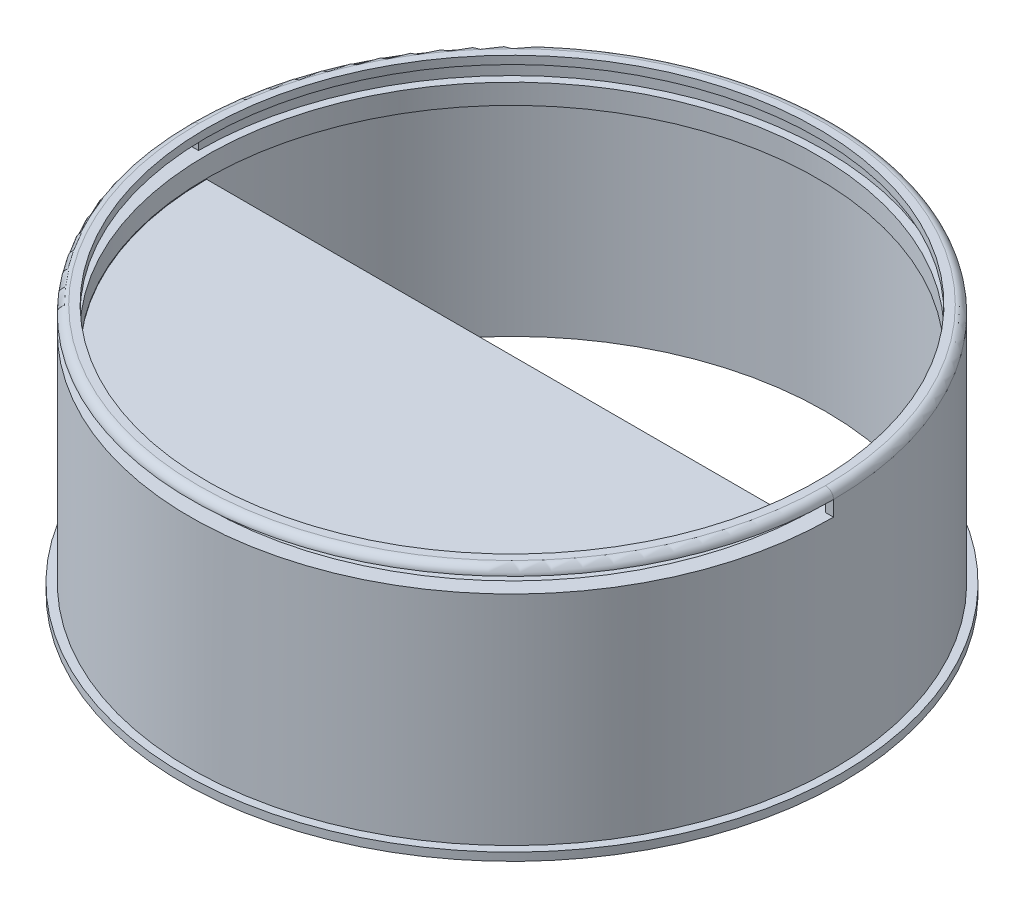
ISO-10303-21;
HEADER;
FILE_DESCRIPTION(('STEP AP214'),'2;1');
FILE_NAME('part.step','',(''),(''),'','','');
FILE_SCHEMA(('AUTOMOTIVE_DESIGN { 1 0 10303 214 1 1 1 1 }'));
ENDSEC;
DATA;
#1=APPLICATION_CONTEXT('core data for automotive mechanical design processes');
#2=APPLICATION_PROTOCOL_DEFINITION('international standard','automotive_design',2000,#1);
#3=PRODUCT_CONTEXT('',#1,'mechanical');
#4=PRODUCT('Part','Part','',(#3));
#5=PRODUCT_RELATED_PRODUCT_CATEGORY('part','',(#4));
#6=PRODUCT_DEFINITION_FORMATION('','',#4);
#7=PRODUCT_DEFINITION_CONTEXT('part definition',#1,'design');
#8=PRODUCT_DEFINITION('design','',#6,#7);
#9=PRODUCT_DEFINITION_SHAPE('','',#8);
#10=(LENGTH_UNIT() NAMED_UNIT(*) SI_UNIT(.MILLI.,.METRE.));
#11=(NAMED_UNIT(*) PLANE_ANGLE_UNIT() SI_UNIT($,.RADIAN.));
#12=(NAMED_UNIT(*) SI_UNIT($,.STERADIAN.) SOLID_ANGLE_UNIT());
#13=UNCERTAINTY_MEASURE_WITH_UNIT(LENGTH_MEASURE(1.E-05),#10,'distance_accuracy_value','');
#14=(GEOMETRIC_REPRESENTATION_CONTEXT(3) GLOBAL_UNCERTAINTY_ASSIGNED_CONTEXT((#13)) GLOBAL_UNIT_ASSIGNED_CONTEXT((#10,
#11,#12)) REPRESENTATION_CONTEXT('',''));
#15=CARTESIAN_POINT('',(0.,0.,0.));
#16=DIRECTION('',(0.,0.,1.));
#17=DIRECTION('',(1.,0.,0.));
#18=AXIS2_PLACEMENT_3D('',#15,#16,#17);
#19=CARTESIAN_POINT('',(0.,1450.,0.));
#20=DIRECTION('',(0.,1.,0.));
#21=DIRECTION('',(0.,0.,1.));
#22=AXIS2_PLACEMENT_3D('',#19,#20,#21);
#23=CYLINDRICAL_SURFACE('',#22,3800.);
#24=CARTESIAN_POINT('',(0.,2450.,0.));
#25=DIRECTION('',(0.,-1.,0.));
#26=DIRECTION('',(0.,0.,-1.));
#27=AXIS2_PLACEMENT_3D('',#24,#25,#26);
#28=CIRCLE('',#27,3800.);
#29=CARTESIAN_POINT('',(3800.,2450.,0.));
#30=VERTEX_POINT('',#29);
#31=CARTESIAN_POINT('',(-3800.,2450.,0.));
#32=VERTEX_POINT('',#31);
#33=EDGE_CURVE('E85',#30,#32,#28,.T.);
#34=ORIENTED_EDGE('',*,*,#33,.T.);
#35=DIRECTION('',(0.,1.,0.));
#36=VECTOR('',#35,1.);
#37=CARTESIAN_POINT('',(-3800.,1450.,0.));
#38=LINE('',#37,#36);
#39=CARTESIAN_POINT('',(-3800.,1450.,0.));
#40=VERTEX_POINT('',#39);
#41=EDGE_CURVE('E12',#40,#32,#38,.T.);
#42=ORIENTED_EDGE('',*,*,#41,.F.);
#43=CARTESIAN_POINT('',(0.,1450.,0.));
#44=DIRECTION('',(0.,-1.,0.));
#45=DIRECTION('',(0.,0.,-1.));
#46=AXIS2_PLACEMENT_3D('',#43,#44,#45);
#47=CIRCLE('',#46,3800.);
#48=CARTESIAN_POINT('',(3800.,1450.,0.));
#49=VERTEX_POINT('',#48);
#50=EDGE_CURVE('E84',#49,#40,#47,.T.);
#51=ORIENTED_EDGE('',*,*,#50,.F.);
#52=DIRECTION('',(0.,1.,0.));
#53=VECTOR('',#52,1.);
#54=CARTESIAN_POINT('',(3800.,1450.,0.));
#55=LINE('',#54,#53);
#56=EDGE_CURVE('E61',#49,#30,#55,.T.);
#57=ORIENTED_EDGE('',*,*,#56,.T.);
#58=EDGE_LOOP('',(#34,#42,#51,#57));
#59=FACE_BOUND('',#58,.T.);
#60=ADVANCED_FACE('F52',(#59),#23,.T.);
#61=CARTESIAN_POINT('',(3800.,1450.,0.));
#62=DIRECTION('',(0.,0.,1.));
#63=DIRECTION('',(1.,0.,0.));
#64=AXIS2_PLACEMENT_3D('',#61,#62,#63);
#65=PLANE('',#64);
#66=DIRECTION('',(1.,0.,0.));
#67=VECTOR('',#66,1.);
#68=CARTESIAN_POINT('',(3800.,2450.,0.));
#69=LINE('',#68,#67);
#70=EDGE_CURVE('E76',#32,#30,#69,.T.);
#71=ORIENTED_EDGE('',*,*,#70,.T.);
#72=ORIENTED_EDGE('',*,*,#56,.F.);
#73=DIRECTION('',(1.,0.,0.));
#74=VECTOR('',#73,1.);
#75=CARTESIAN_POINT('',(3800.,1450.,0.));
#76=LINE('',#75,#74);
#77=EDGE_CURVE('E68',#40,#49,#76,.T.);
#78=ORIENTED_EDGE('',*,*,#77,.F.);
#79=ORIENTED_EDGE('',*,*,#41,.T.);
#80=EDGE_LOOP('',(#71,#72,#78,#79));
#81=FACE_BOUND('',#80,.T.);
#82=ADVANCED_FACE('F79',(#81),#65,.F.);
#83=CARTESIAN_POINT('',(0.,1450.,0.));
#84=DIRECTION('',(0.,-1.,0.));
#85=DIRECTION('',(0.,0.,-1.));
#86=AXIS2_PLACEMENT_3D('',#83,#84,#85);
#87=PLANE('',#86);
#88=ORIENTED_EDGE('',*,*,#50,.T.);
#89=ORIENTED_EDGE('',*,*,#77,.T.);
#90=EDGE_LOOP('',(#88,#89));
#91=FACE_BOUND('',#90,.T.);
#92=ADVANCED_FACE('F96',(#91),#87,.T.);
#93=CARTESIAN_POINT('',(0.,2450.,0.));
#94=DIRECTION('',(0.,-1.,0.));
#95=DIRECTION('',(0.,0.,-1.));
#96=AXIS2_PLACEMENT_3D('',#93,#94,#95);
#97=PLANE('',#96);
#98=ORIENTED_EDGE('',*,*,#33,.F.);
#99=ORIENTED_EDGE('',*,*,#70,.F.);
#100=EDGE_LOOP('',(#98,#99));
#101=FACE_BOUND('',#100,.T.);
#102=ADVANCED_FACE('F89',(#101),#97,.F.);
#103=CLOSED_SHELL('',(#60,#82,#92,#102));
#104=MANIFOLD_SOLID_BREP('B2',#103);
#105=CARTESIAN_POINT('',(4324.59933651313,2710.,0.));
#106=DIRECTION('',(0.,0.,-1.));
#107=DIRECTION('',(-1.,0.,0.));
#108=AXIS2_PLACEMENT_3D('',#105,#106,#107);
#109=PLANE('',#108);
#110=DIRECTION('',(1.,0.,0.));
#111=VECTOR('',#110,1.);
#112=CARTESIAN_POINT('',(0.,2900.,0.));
#113=LINE('',#112,#111);
#114=CARTESIAN_POINT('',(3900.,2900.,0.));
#115=VERTEX_POINT('',#114);
#116=CARTESIAN_POINT('',(4000.,2900.,0.));
#117=VERTEX_POINT('',#116);
#118=EDGE_CURVE('E203',#115,#117,#113,.T.);
#119=ORIENTED_EDGE('',*,*,#118,.F.);
#120=DIRECTION('',(0.,-1.,0.));
#121=VECTOR('',#120,1.);
#122=CARTESIAN_POINT('',(3900.,3000.,0.));
#123=LINE('',#122,#121);
#124=CARTESIAN_POINT('',(3900.,2710.,0.));
#125=VERTEX_POINT('',#124);
#126=EDGE_CURVE('E234',#115,#125,#123,.T.);
#127=ORIENTED_EDGE('',*,*,#126,.T.);
#128=DIRECTION('',(-1.,0.,0.));
#129=VECTOR('',#128,1.);
#130=CARTESIAN_POINT('',(4324.59933651313,2710.,0.));
#131=LINE('',#130,#129);
#132=CARTESIAN_POINT('',(4000.,2710.,0.));
#133=VERTEX_POINT('',#132);
#134=EDGE_CURVE('E206',#133,#125,#131,.T.);
#135=ORIENTED_EDGE('',*,*,#134,.F.);
#136=DIRECTION('',(0.,-1.,0.));
#137=VECTOR('',#136,1.);
#138=CARTESIAN_POINT('',(4000.,3000.,0.));
#139=LINE('',#138,#137);
#140=EDGE_CURVE('E183',#117,#133,#139,.T.);
#141=ORIENTED_EDGE('',*,*,#140,.F.);
#142=EDGE_LOOP('',(#119,#127,#135,#141));
#143=FACE_BOUND('',#142,.T.);
#144=ADVANCED_FACE('F130',(#143),#109,.F.);
#145=DIRECTION('',(1.,0.,0.));
#146=VECTOR('',#145,1.);
#147=CARTESIAN_POINT('',(0.,2900.,0.));
#148=LINE('',#147,#146);
#149=CARTESIAN_POINT('',(-4000.,2900.,0.));
#150=VERTEX_POINT('',#149);
#151=CARTESIAN_POINT('',(-3900.,2900.,0.));
#152=VERTEX_POINT('',#151);
#153=EDGE_CURVE('E145',#150,#152,#148,.T.);
#154=ORIENTED_EDGE('',*,*,#153,.F.);
#155=DIRECTION('',(0.,-1.,0.));
#156=VECTOR('',#155,1.);
#157=CARTESIAN_POINT('',(-4000.,3000.,0.));
#158=LINE('',#157,#156);
#159=CARTESIAN_POINT('',(-4000.,2710.,0.));
#160=VERTEX_POINT('',#159);
#161=EDGE_CURVE('E184',#160,#150,#158,.F.);
#162=ORIENTED_EDGE('',*,*,#161,.F.);
#163=CARTESIAN_POINT('',(-3900.,2710.,0.));
#164=VERTEX_POINT('',#163);
#165=EDGE_CURVE('E230',#164,#160,#131,.T.);
#166=ORIENTED_EDGE('',*,*,#165,.F.);
#167=DIRECTION('',(0.,-1.,0.));
#168=VECTOR('',#167,1.);
#169=CARTESIAN_POINT('',(-3900.,3000.,0.));
#170=LINE('',#169,#168);
#171=EDGE_CURVE('E150',#164,#152,#170,.F.);
#172=ORIENTED_EDGE('',*,*,#171,.T.);
#173=EDGE_LOOP('',(#154,#162,#166,#172));
#174=FACE_BOUND('',#173,.T.);
#175=ADVANCED_FACE('F259',(#174),#109,.F.);
#176=CARTESIAN_POINT('',(-1.22464679914735E-13,3000.,0.));
#177=DIRECTION('',(0.,-1.,0.));
#178=DIRECTION('',(1.,0.,0.));
#179=AXIS2_PLACEMENT_3D('',#176,#177,#178);
#180=CYLINDRICAL_SURFACE('',#179,3900.);
#181=CARTESIAN_POINT('',(0.,-100.,0.));
#182=DIRECTION('',(0.,-1.,0.));
#183=DIRECTION('',(1.,0.,0.));
#184=AXIS2_PLACEMENT_3D('',#181,#182,#183);
#185=CIRCLE('',#184,3900.);
#186=CARTESIAN_POINT('',(3900.,-99.9999999999999,0.));
#187=VERTEX_POINT('',#186);
#188=EDGE_CURVE('E247',#187,#187,#185,.T.);
#189=ORIENTED_EDGE('',*,*,#188,.T.);
#190=EDGE_LOOP('',(#189));
#191=FACE_BOUND('',#190,.T.);
#192=CARTESIAN_POINT('',(0.,2460.,0.));
#193=DIRECTION('',(0.,1.,0.));
#194=DIRECTION('',(0.,0.,1.));
#195=AXIS2_PLACEMENT_3D('',#192,#193,#194);
#196=CIRCLE('',#195,3900.);
#197=CARTESIAN_POINT('',(0.,2460.,3900.));
#198=VERTEX_POINT('',#197);
#199=EDGE_CURVE('E227',#198,#198,#196,.T.);
#200=ORIENTED_EDGE('',*,*,#199,.T.);
#201=EDGE_LOOP('',(#200));
#202=FACE_BOUND('',#201,.T.);
#203=ADVANCED_FACE('F265',(#191,#202),#180,.F.);
#204=CARTESIAN_POINT('',(0.,0.,0.));
#205=DIRECTION('',(0.,-1.,0.));
#206=DIRECTION('',(1.,0.,0.));
#207=AXIS2_PLACEMENT_3D('',#204,#205,#206);
#208=CYLINDRICAL_SURFACE('',#207,4100.);
#209=CARTESIAN_POINT('',(0.,-100.,0.));
#210=DIRECTION('',(0.,-1.,0.));
#211=DIRECTION('',(1.,0.,0.));
#212=AXIS2_PLACEMENT_3D('',#209,#210,#211);
#213=CIRCLE('',#212,4100.);
#214=CARTESIAN_POINT('',(4100.,-99.9999999999998,0.));
#215=VERTEX_POINT('',#214);
#216=EDGE_CURVE('E246',#215,#215,#213,.T.);
#217=ORIENTED_EDGE('',*,*,#216,.F.);
#218=EDGE_LOOP('',(#217));
#219=FACE_BOUND('',#218,.T.);
#220=CARTESIAN_POINT('',(0.,0.,0.));
#221=DIRECTION('',(0.,-1.,0.));
#222=DIRECTION('',(1.,0.,0.));
#223=AXIS2_PLACEMENT_3D('',#220,#221,#222);
#224=CIRCLE('',#223,4100.);
#225=CARTESIAN_POINT('',(4100.,1.67368395883472E-13,0.));
#226=VERTEX_POINT('',#225);
#227=EDGE_CURVE('E188',#226,#226,#224,.T.);
#228=ORIENTED_EDGE('',*,*,#227,.T.);
#229=EDGE_LOOP('',(#228));
#230=FACE_BOUND('',#229,.T.);
#231=ADVANCED_FACE('F275',(#219,#230),#208,.T.);
#232=CARTESIAN_POINT('',(-1.18382523917578E-13,2900.,0.));
#233=DIRECTION('',(0.,-1.,0.));
#234=DIRECTION('',(1.,0.,0.));
#235=AXIS2_PLACEMENT_3D('',#232,#233,#234);
#236=PLANE('',#235);
#237=CARTESIAN_POINT('',(-1.18382523917578E-13,2900.,0.));
#238=DIRECTION('',(0.,-1.,0.));
#239=DIRECTION('',(1.,0.,0.));
#240=AXIS2_PLACEMENT_3D('',#237,#238,#239);
#241=CIRCLE('',#240,3900.);
#242=EDGE_CURVE('E215',#152,#115,#241,.T.);
#243=ORIENTED_EDGE('',*,*,#242,.T.);
#244=ORIENTED_EDGE('',*,*,#118,.T.);
#245=CARTESIAN_POINT('',(0.,2900.,-3.63619706969001E-12));
#246=DIRECTION('',(0.,1.,0.));
#247=DIRECTION('',(0.,0.,1.));
#248=AXIS2_PLACEMENT_3D('',#245,#246,#247);
#249=CIRCLE('',#248,4000.);
#250=EDGE_CURVE('E213',#150,#117,#249,.T.);
#251=ORIENTED_EDGE('',*,*,#250,.F.);
#252=ORIENTED_EDGE('',*,*,#153,.T.);
#253=EDGE_LOOP('',(#243,#244,#251,#252));
#254=FACE_BOUND('',#253,.T.);
#255=CARTESIAN_POINT('',(-1.18382523917578E-13,2900.,0.));
#256=DIRECTION('',(0.,1.,0.));
#257=DIRECTION('',(-1.,0.,0.));
#258=AXIS2_PLACEMENT_3D('',#255,#256,#257);
#259=CIRCLE('',#258,3800.);
#260=CARTESIAN_POINT('',(-3800.,2900.,0.));
#261=VERTEX_POINT('',#260);
#262=EDGE_CURVE('E239',#261,#261,#259,.T.);
#263=ORIENTED_EDGE('',*,*,#262,.T.);
#264=EDGE_LOOP('',(#263));
#265=FACE_BOUND('',#264,.T.);
#266=ADVANCED_FACE('F211',(#254,#265),#236,.T.);
#267=CARTESIAN_POINT('',(0.,2710.,0.));
#268=DIRECTION('',(0.,1.,0.));
#269=DIRECTION('',(0.,0.,1.));
#270=AXIS2_PLACEMENT_3D('',#267,#268,#269);
#271=CIRCLE('',#270,3900.);
#272=EDGE_CURVE('E224',#125,#164,#271,.T.);
#273=ORIENTED_EDGE('',*,*,#272,.F.);
#274=ORIENTED_EDGE('',*,*,#126,.F.);
#275=ORIENTED_EDGE('',*,*,#242,.F.);
#276=ORIENTED_EDGE('',*,*,#171,.F.);
#277=EDGE_LOOP('',(#273,#274,#275,#276));
#278=FACE_BOUND('',#277,.T.);
#279=ADVANCED_FACE('F261',(#278),#180,.F.);
#280=CARTESIAN_POINT('',(4000.,-100.,0.));
#281=DIRECTION('',(0.,-1.,0.));
#282=DIRECTION('',(1.,0.,0.));
#283=AXIS2_PLACEMENT_3D('',#280,#281,#282);
#284=PLANE('',#283);
#285=ORIENTED_EDGE('',*,*,#216,.T.);
#286=EDGE_LOOP('',(#285));
#287=FACE_BOUND('',#286,.T.);
#288=ORIENTED_EDGE('',*,*,#188,.F.);
#289=EDGE_LOOP('',(#288));
#290=FACE_BOUND('',#289,.T.);
#291=ADVANCED_FACE('F263',(#287,#290),#284,.T.);
#292=CARTESIAN_POINT('',(-1.22464679914735E-13,3000.,0.));
#293=DIRECTION('',(0.,-1.,0.));
#294=DIRECTION('',(1.,0.,0.));
#295=AXIS2_PLACEMENT_3D('',#292,#293,#294);
#296=PLANE('',#295);
#297=CARTESIAN_POINT('',(-1.22464679914735E-13,3000.,0.));
#298=DIRECTION('',(0.,1.,0.));
#299=DIRECTION('',(-1.,0.,0.));
#300=AXIS2_PLACEMENT_3D('',#297,#298,#299);
#301=CIRCLE('',#300,3800.);
#302=CARTESIAN_POINT('',(-3800.,3000.,0.));
#303=VERTEX_POINT('',#302);
#304=EDGE_CURVE('E197',#303,#303,#301,.T.);
#305=ORIENTED_EDGE('',*,*,#304,.F.);
#306=EDGE_LOOP('',(#305));
#307=FACE_BOUND('',#306,.T.);
#308=CARTESIAN_POINT('',(-1.22464679914735E-13,3000.,0.));
#309=DIRECTION('',(0.,-1.,0.));
#310=DIRECTION('',(1.,0.,0.));
#311=AXIS2_PLACEMENT_3D('',#308,#309,#310);
#312=CIRCLE('',#311,3900.);
#313=CARTESIAN_POINT('',(-3900.,3000.,0.));
#314=VERTEX_POINT('',#313);
#315=CARTESIAN_POINT('',(3900.,3000.,0.));
#316=VERTEX_POINT('',#315);
#317=EDGE_CURVE('E187',#314,#316,#312,.T.);
#318=ORIENTED_EDGE('',*,*,#317,.F.);
#319=CARTESIAN_POINT('',(0.,3000.,-3.63619706969001E-12));
#320=DIRECTION('',(0.,-1.,0.));
#321=DIRECTION('',(1.,0.,0.));
#322=AXIS2_PLACEMENT_3D('',#319,#320,#321);
#323=CIRCLE('',#322,3900.);
#324=EDGE_CURVE('E50',#314,#316,#323,.F.);
#325=ORIENTED_EDGE('',*,*,#324,.T.);
#326=EDGE_LOOP('',(#318,#325));
#327=FACE_BOUND('',#326,.T.);
#328=ADVANCED_FACE('F271',(#307,#327),#296,.F.);
#329=CARTESIAN_POINT('',(0.,2900.,0.));
#330=DIRECTION('',(0.,-1.,0.));
#331=DIRECTION('',(1.,0.,0.));
#332=AXIS2_PLACEMENT_3D('',#329,#330,#331);
#333=TOROIDAL_SURFACE('',#332,3900.,100.);
#334=ORIENTED_EDGE('',*,*,#317,.T.);
#335=CARTESIAN_POINT('',(3900.,2900.,0.));
#336=DIRECTION('',(0.,0.,-1.));
#337=DIRECTION('',(-1.,0.,0.));
#338=AXIS2_PLACEMENT_3D('',#335,#336,#337);
#339=CIRCLE('',#338,100.);
#340=EDGE_CURVE('E191',#316,#117,#339,.T.);
#341=ORIENTED_EDGE('',*,*,#340,.T.);
#342=CARTESIAN_POINT('',(-1.18382523917577E-13,2900.,0.));
#343=DIRECTION('',(0.,-1.,0.));
#344=DIRECTION('',(1.,0.,0.));
#345=AXIS2_PLACEMENT_3D('',#342,#343,#344);
#346=CIRCLE('',#345,4000.);
#347=EDGE_CURVE('E177',#150,#117,#346,.T.);
#348=ORIENTED_EDGE('',*,*,#347,.F.);
#349=CARTESIAN_POINT('',(-3900.,2900.,0.));
#350=DIRECTION('',(0.,0.,-1.));
#351=DIRECTION('',(-1.,0.,0.));
#352=AXIS2_PLACEMENT_3D('',#349,#350,#351);
#353=CIRCLE('',#352,100.);
#354=EDGE_CURVE('E207',#150,#314,#353,.T.);
#355=ORIENTED_EDGE('',*,*,#354,.T.);
#356=EDGE_LOOP('',(#334,#341,#348,#355));
#357=FACE_BOUND('',#356,.T.);
#358=ADVANCED_FACE('F192',(#357),#333,.T.);
#359=CARTESIAN_POINT('',(-1.22464679914735E-13,3000.,0.));
#360=DIRECTION('',(0.,-1.,0.));
#361=DIRECTION('',(1.,0.,0.));
#362=AXIS2_PLACEMENT_3D('',#359,#360,#361);
#363=CYLINDRICAL_SURFACE('',#362,4000.);
#364=ORIENTED_EDGE('',*,*,#347,.T.);
#365=ORIENTED_EDGE('',*,*,#140,.T.);
#366=CARTESIAN_POINT('',(-1.10626427522978E-13,2710.,0.));
#367=DIRECTION('',(0.,-1.,0.));
#368=DIRECTION('',(0.,0.,-1.));
#369=AXIS2_PLACEMENT_3D('',#366,#367,#368);
#370=CIRCLE('',#369,4000.);
#371=EDGE_CURVE('E138',#133,#160,#370,.T.);
#372=ORIENTED_EDGE('',*,*,#371,.T.);
#373=ORIENTED_EDGE('',*,*,#161,.T.);
#374=EDGE_LOOP('',(#364,#365,#372,#373));
#375=FACE_BOUND('',#374,.T.);
#376=CARTESIAN_POINT('',(0.,0.,0.));
#377=DIRECTION('',(0.,-1.,0.));
#378=DIRECTION('',(1.,0.,0.));
#379=AXIS2_PLACEMENT_3D('',#376,#377,#378);
#380=CIRCLE('',#379,4000.);
#381=CARTESIAN_POINT('',(4000.,1.63286239886314E-13,0.));
#382=VERTEX_POINT('',#381);
#383=EDGE_CURVE('E242',#382,#382,#380,.T.);
#384=ORIENTED_EDGE('',*,*,#383,.F.);
#385=EDGE_LOOP('',(#384));
#386=FACE_BOUND('',#385,.T.);
#387=ADVANCED_FACE('F179',(#375,#386),#363,.T.);
#388=CARTESIAN_POINT('',(4000.,0.,0.));
#389=DIRECTION('',(0.,-1.,0.));
#390=DIRECTION('',(1.,0.,0.));
#391=AXIS2_PLACEMENT_3D('',#388,#389,#390);
#392=PLANE('',#391);
#393=ORIENTED_EDGE('',*,*,#227,.F.);
#394=EDGE_LOOP('',(#393));
#395=FACE_BOUND('',#394,.T.);
#396=ORIENTED_EDGE('',*,*,#383,.T.);
#397=EDGE_LOOP('',(#396));
#398=FACE_BOUND('',#397,.T.);
#399=ADVANCED_FACE('F289',(#395,#398),#392,.F.);
#400=CARTESIAN_POINT('',(-1.18382523917578E-13,2900.,0.));
#401=DIRECTION('',(0.,1.,0.));
#402=DIRECTION('',(-1.,0.,0.));
#403=AXIS2_PLACEMENT_3D('',#400,#401,#402);
#404=CYLINDRICAL_SURFACE('',#403,3800.);
#405=ORIENTED_EDGE('',*,*,#304,.T.);
#406=EDGE_LOOP('',(#405));
#407=FACE_BOUND('',#406,.T.);
#408=ORIENTED_EDGE('',*,*,#262,.F.);
#409=EDGE_LOOP('',(#408));
#410=FACE_BOUND('',#409,.T.);
#411=ADVANCED_FACE('F287',(#407,#410),#404,.F.);
#412=CARTESIAN_POINT('',(0.,2710.,0.));
#413=DIRECTION('',(0.,-1.,0.));
#414=DIRECTION('',(0.,0.,-1.));
#415=AXIS2_PLACEMENT_3D('',#412,#413,#414);
#416=PLANE('',#415);
#417=ORIENTED_EDGE('',*,*,#134,.T.);
#418=ORIENTED_EDGE('',*,*,#272,.T.);
#419=ORIENTED_EDGE('',*,*,#165,.T.);
#420=ORIENTED_EDGE('',*,*,#371,.F.);
#421=EDGE_LOOP('',(#417,#418,#419,#420));
#422=FACE_BOUND('',#421,.T.);
#423=CARTESIAN_POINT('',(0.,2710.,0.));
#424=DIRECTION('',(0.,1.,0.));
#425=DIRECTION('',(0.,0.,1.));
#426=AXIS2_PLACEMENT_3D('',#423,#424,#425);
#427=CIRCLE('',#426,3800.);
#428=CARTESIAN_POINT('',(0.,2710.,3800.));
#429=VERTEX_POINT('',#428);
#430=EDGE_CURVE('E216',#429,#429,#427,.T.);
#431=ORIENTED_EDGE('',*,*,#430,.F.);
#432=EDGE_LOOP('',(#431));
#433=FACE_BOUND('',#432,.T.);
#434=ADVANCED_FACE('F257',(#422,#433),#416,.F.);
#435=CARTESIAN_POINT('',(0.,2460.,0.));
#436=DIRECTION('',(0.,1.,0.));
#437=DIRECTION('',(0.,0.,1.));
#438=AXIS2_PLACEMENT_3D('',#435,#436,#437);
#439=PLANE('',#438);
#440=CARTESIAN_POINT('',(0.,2460.,0.));
#441=DIRECTION('',(0.,1.,0.));
#442=DIRECTION('',(0.,0.,1.));
#443=AXIS2_PLACEMENT_3D('',#440,#441,#442);
#444=CIRCLE('',#443,3800.);
#445=CARTESIAN_POINT('',(0.,2460.,3800.));
#446=VERTEX_POINT('',#445);
#447=EDGE_CURVE('E221',#446,#446,#444,.T.);
#448=ORIENTED_EDGE('',*,*,#447,.T.);
#449=EDGE_LOOP('',(#448));
#450=FACE_BOUND('',#449,.T.);
#451=ORIENTED_EDGE('',*,*,#199,.F.);
#452=EDGE_LOOP('',(#451));
#453=FACE_BOUND('',#452,.T.);
#454=ADVANCED_FACE('F295',(#450,#453),#439,.F.);
#455=CARTESIAN_POINT('',(0.,2460.,0.));
#456=DIRECTION('',(0.,1.,0.));
#457=DIRECTION('',(0.,0.,1.));
#458=AXIS2_PLACEMENT_3D('',#455,#456,#457);
#459=CYLINDRICAL_SURFACE('',#458,3800.);
#460=ORIENTED_EDGE('',*,*,#447,.F.);
#461=EDGE_LOOP('',(#460));
#462=FACE_BOUND('',#461,.T.);
#463=ORIENTED_EDGE('',*,*,#430,.T.);
#464=EDGE_LOOP('',(#463));
#465=FACE_BOUND('',#464,.T.);
#466=ADVANCED_FACE('F329',(#462,#465),#459,.F.);
#467=CARTESIAN_POINT('',(0.,2900.,-3.63619706969001E-12));
#468=DIRECTION('',(0.,-1.,0.));
#469=DIRECTION('',(1.,0.,0.));
#470=AXIS2_PLACEMENT_3D('',#467,#468,#469);
#471=TOROIDAL_SURFACE('',#470,3900.,100.);
#472=ORIENTED_EDGE('',*,*,#354,.F.);
#473=ORIENTED_EDGE('',*,*,#250,.T.);
#474=ORIENTED_EDGE('',*,*,#340,.F.);
#475=ORIENTED_EDGE('',*,*,#324,.F.);
#476=EDGE_LOOP('',(#472,#473,#474,#475));
#477=FACE_BOUND('',#476,.T.);
#478=ADVANCED_FACE('F132',(#477),#471,.T.);
#479=CLOSED_SHELL('',(#144,#175,#203,#231,#266,#279,#291,#328,#358,#387,#399,#411,#434,#454,
#466,#478));
#480=MANIFOLD_SOLID_BREP('B6',#479);
#481=ADVANCED_BREP_SHAPE_REPRESENTATION('',(#18,#104,#480),#14);
#482=SHAPE_DEFINITION_REPRESENTATION(#9,#481);
ENDSEC;
END-ISO-10303-21;
